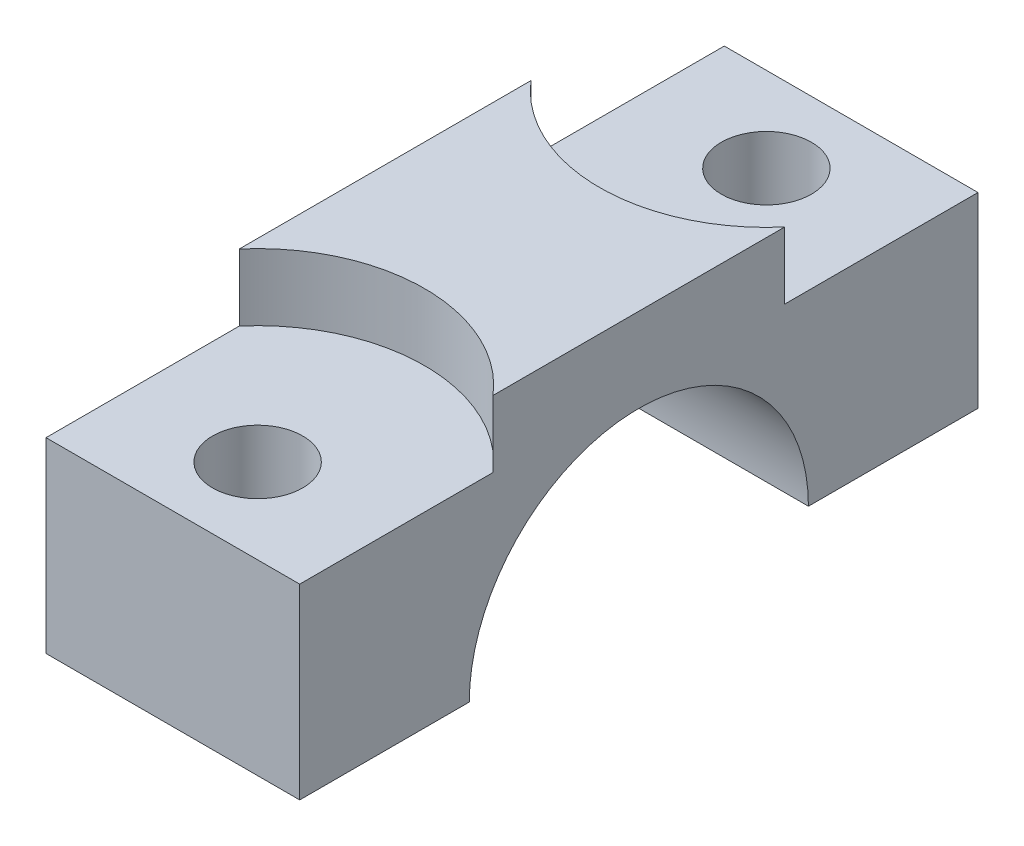
ISO-10303-21;
HEADER;
FILE_DESCRIPTION(('STEP AP214'),'2;1');
FILE_NAME('part.step','',(''),(''),'','','');
FILE_SCHEMA(('AUTOMOTIVE_DESIGN { 1 0 10303 214 1 1 1 1 }'));
ENDSEC;
DATA;
#1=APPLICATION_CONTEXT('core data for automotive mechanical design processes');
#2=APPLICATION_PROTOCOL_DEFINITION('international standard','automotive_design',2000,#1);
#3=PRODUCT_CONTEXT('',#1,'mechanical');
#4=PRODUCT('Part','Part','',(#3));
#5=PRODUCT_RELATED_PRODUCT_CATEGORY('part','',(#4));
#6=PRODUCT_DEFINITION_FORMATION('','',#4);
#7=PRODUCT_DEFINITION_CONTEXT('part definition',#1,'design');
#8=PRODUCT_DEFINITION('design','',#6,#7);
#9=PRODUCT_DEFINITION_SHAPE('','',#8);
#10=(LENGTH_UNIT() NAMED_UNIT(*) SI_UNIT(.MILLI.,.METRE.));
#11=(NAMED_UNIT(*) PLANE_ANGLE_UNIT() SI_UNIT($,.RADIAN.));
#12=(NAMED_UNIT(*) SI_UNIT($,.STERADIAN.) SOLID_ANGLE_UNIT());
#13=UNCERTAINTY_MEASURE_WITH_UNIT(LENGTH_MEASURE(1.E-05),#10,'distance_accuracy_value','');
#14=(GEOMETRIC_REPRESENTATION_CONTEXT(3) GLOBAL_UNCERTAINTY_ASSIGNED_CONTEXT((#13)) GLOBAL_UNIT_ASSIGNED_CONTEXT((#10,
#11,#12)) REPRESENTATION_CONTEXT('',''));
#15=CARTESIAN_POINT('',(0.,0.,0.));
#16=DIRECTION('',(0.,0.,1.));
#17=DIRECTION('',(1.,0.,0.));
#18=AXIS2_PLACEMENT_3D('',#15,#16,#17);
#19=CARTESIAN_POINT('',(9.5,19.,25.4));
#20=DIRECTION('',(0.,-1.,0.));
#21=DIRECTION('',(0.,0.,-1.));
#22=AXIS2_PLACEMENT_3D('',#19,#20,#21);
#23=PLANE('',#22);
#24=DIRECTION('',(0.,0.,1.));
#25=VECTOR('',#24,1.);
#26=CARTESIAN_POINT('',(9.5,19.,25.4));
#27=LINE('',#26,#25);
#28=CARTESIAN_POINT('',(9.5,19.,-10.925961595364));
#29=VERTEX_POINT('',#28);
#30=CARTESIAN_POINT('',(9.5,19.,10.925961595364));
#31=VERTEX_POINT('',#30);
#32=EDGE_CURVE('E163',#29,#31,#27,.T.);
#33=ORIENTED_EDGE('',*,*,#32,.F.);
#34=CARTESIAN_POINT('',(0.,19.,-19.05));
#35=DIRECTION('',(0.,1.,0.));
#36=DIRECTION('',(0.,0.,1.));
#37=AXIS2_PLACEMENT_3D('',#34,#35,#36);
#38=CIRCLE('',#37,12.5);
#39=CARTESIAN_POINT('',(-9.5,19.,-10.925961595364));
#40=VERTEX_POINT('',#39);
#41=EDGE_CURVE('E115',#40,#29,#38,.T.);
#42=ORIENTED_EDGE('',*,*,#41,.F.);
#43=DIRECTION('',(0.,0.,1.));
#44=VECTOR('',#43,1.);
#45=CARTESIAN_POINT('',(-9.5,19.,25.4));
#46=LINE('',#45,#44);
#47=CARTESIAN_POINT('',(-9.5,19.,10.925961595364));
#48=VERTEX_POINT('',#47);
#49=EDGE_CURVE('E55',#40,#48,#46,.T.);
#50=ORIENTED_EDGE('',*,*,#49,.T.);
#51=CARTESIAN_POINT('',(0.,19.,19.05));
#52=DIRECTION('',(0.,1.,0.));
#53=DIRECTION('',(0.,0.,1.));
#54=AXIS2_PLACEMENT_3D('',#51,#52,#53);
#55=CIRCLE('',#54,12.5);
#56=EDGE_CURVE('E119',#31,#48,#55,.T.);
#57=ORIENTED_EDGE('',*,*,#56,.F.);
#58=EDGE_LOOP('',(#33,#42,#50,#57));
#59=FACE_BOUND('',#58,.T.);
#60=ADVANCED_FACE('F32',(#59),#23,.F.);
#61=CARTESIAN_POINT('',(9.5,0.,25.4));
#62=DIRECTION('',(0.,0.,-1.));
#63=DIRECTION('',(-1.,0.,0.));
#64=AXIS2_PLACEMENT_3D('',#61,#62,#63);
#65=PLANE('',#64);
#66=DIRECTION('',(0.,-1.,0.));
#67=VECTOR('',#66,1.);
#68=CARTESIAN_POINT('',(9.5,0.,25.4));
#69=LINE('',#68,#67);
#70=CARTESIAN_POINT('',(9.5,14.,25.4));
#71=VERTEX_POINT('',#70);
#72=CARTESIAN_POINT('',(9.5,0.,25.4));
#73=VERTEX_POINT('',#72);
#74=EDGE_CURVE('E154',#71,#73,#69,.T.);
#75=ORIENTED_EDGE('',*,*,#74,.F.);
#76=DIRECTION('',(-1.,0.,0.));
#77=VECTOR('',#76,1.);
#78=CARTESIAN_POINT('',(9.5,14.,25.4));
#79=LINE('',#78,#77);
#80=CARTESIAN_POINT('',(-9.5,14.,25.4));
#81=VERTEX_POINT('',#80);
#82=EDGE_CURVE('E148',#71,#81,#79,.T.);
#83=ORIENTED_EDGE('',*,*,#82,.T.);
#84=DIRECTION('',(0.,-1.,0.));
#85=VECTOR('',#84,1.);
#86=CARTESIAN_POINT('',(-9.5,0.,25.4));
#87=LINE('',#86,#85);
#88=CARTESIAN_POINT('',(-9.5,0.,25.4));
#89=VERTEX_POINT('',#88);
#90=EDGE_CURVE('E153',#81,#89,#87,.T.);
#91=ORIENTED_EDGE('',*,*,#90,.T.);
#92=DIRECTION('',(-1.,0.,0.));
#93=VECTOR('',#92,1.);
#94=CARTESIAN_POINT('',(9.5,0.,25.4));
#95=LINE('',#94,#93);
#96=EDGE_CURVE('E185',#73,#89,#95,.T.);
#97=ORIENTED_EDGE('',*,*,#96,.F.);
#98=EDGE_LOOP('',(#75,#83,#91,#97));
#99=FACE_BOUND('',#98,.T.);
#100=ADVANCED_FACE('F34',(#99),#65,.F.);
#101=CARTESIAN_POINT('',(9.5,0.,25.4));
#102=DIRECTION('',(0.,1.,0.));
#103=DIRECTION('',(0.,0.,1.));
#104=AXIS2_PLACEMENT_3D('',#101,#102,#103);
#105=PLANE('',#104);
#106=CARTESIAN_POINT('',(0.,0.,19.05));
#107=DIRECTION('',(0.,1.,0.));
#108=DIRECTION('',(0.,0.,1.));
#109=AXIS2_PLACEMENT_3D('',#106,#107,#108);
#110=CIRCLE('',#109,3.375);
#111=CARTESIAN_POINT('',(0.,0.,22.425));
#112=VERTEX_POINT('',#111);
#113=EDGE_CURVE('E142',#112,#112,#110,.T.);
#114=ORIENTED_EDGE('',*,*,#113,.T.);
#115=EDGE_LOOP('',(#114));
#116=FACE_BOUND('',#115,.T.);
#117=DIRECTION('',(0.,0.,-1.));
#118=VECTOR('',#117,1.);
#119=CARTESIAN_POINT('',(-9.5,0.,25.4));
#120=LINE('',#119,#118);
#121=CARTESIAN_POINT('',(-9.5,0.,12.7));
#122=VERTEX_POINT('',#121);
#123=EDGE_CURVE('E167',#89,#122,#120,.T.);
#124=ORIENTED_EDGE('',*,*,#123,.T.);
#125=DIRECTION('',(-1.,0.,0.));
#126=VECTOR('',#125,1.);
#127=CARTESIAN_POINT('',(9.5,0.,12.7));
#128=LINE('',#127,#126);
#129=CARTESIAN_POINT('',(9.5,0.,12.7));
#130=VERTEX_POINT('',#129);
#131=EDGE_CURVE('E182',#130,#122,#128,.T.);
#132=ORIENTED_EDGE('',*,*,#131,.F.);
#133=DIRECTION('',(0.,0.,-1.));
#134=VECTOR('',#133,1.);
#135=CARTESIAN_POINT('',(9.5,0.,25.4));
#136=LINE('',#135,#134);
#137=EDGE_CURVE('E156',#73,#130,#136,.T.);
#138=ORIENTED_EDGE('',*,*,#137,.F.);
#139=ORIENTED_EDGE('',*,*,#96,.T.);
#140=EDGE_LOOP('',(#124,#132,#138,#139));
#141=FACE_BOUND('',#140,.T.);
#142=ADVANCED_FACE('F213',(#116,#141),#105,.F.);
#143=CARTESIAN_POINT('',(9.5,0.,0.));
#144=DIRECTION('',(-1.,0.,0.));
#145=DIRECTION('',(0.,0.,1.));
#146=AXIS2_PLACEMENT_3D('',#143,#144,#145);
#147=CYLINDRICAL_SURFACE('',#146,12.7);
#148=CARTESIAN_POINT('',(-9.5,0.,0.));
#149=DIRECTION('',(-1.,0.,0.));
#150=DIRECTION('',(0.,0.,-1.));
#151=AXIS2_PLACEMENT_3D('',#148,#149,#150);
#152=CIRCLE('',#151,12.7);
#153=CARTESIAN_POINT('',(-9.5,0.,-12.7));
#154=VERTEX_POINT('',#153);
#155=EDGE_CURVE('E169',#122,#154,#152,.T.);
#156=ORIENTED_EDGE('',*,*,#155,.T.);
#157=DIRECTION('',(-1.,0.,0.));
#158=VECTOR('',#157,1.);
#159=CARTESIAN_POINT('',(9.5,0.,-12.7));
#160=LINE('',#159,#158);
#161=CARTESIAN_POINT('',(9.5,0.,-12.7));
#162=VERTEX_POINT('',#161);
#163=EDGE_CURVE('E179',#162,#154,#160,.T.);
#164=ORIENTED_EDGE('',*,*,#163,.F.);
#165=CARTESIAN_POINT('',(9.5,0.,0.));
#166=DIRECTION('',(-1.,0.,0.));
#167=DIRECTION('',(0.,0.,-1.));
#168=AXIS2_PLACEMENT_3D('',#165,#166,#167);
#169=CIRCLE('',#168,12.7);
#170=EDGE_CURVE('E158',#130,#162,#169,.T.);
#171=ORIENTED_EDGE('',*,*,#170,.F.);
#172=ORIENTED_EDGE('',*,*,#131,.T.);
#173=EDGE_LOOP('',(#156,#164,#171,#172));
#174=FACE_BOUND('',#173,.T.);
#175=ADVANCED_FACE('F208',(#174),#147,.F.);
#176=CARTESIAN_POINT('',(9.5,0.,-12.7));
#177=DIRECTION('',(0.,1.,0.));
#178=DIRECTION('',(0.,0.,1.));
#179=AXIS2_PLACEMENT_3D('',#176,#177,#178);
#180=PLANE('',#179);
#181=CARTESIAN_POINT('',(0.,0.,-19.05));
#182=DIRECTION('',(0.,1.,0.));
#183=DIRECTION('',(0.,0.,1.));
#184=AXIS2_PLACEMENT_3D('',#181,#182,#183);
#185=CIRCLE('',#184,3.375);
#186=CARTESIAN_POINT('',(0.,0.,-15.675));
#187=VERTEX_POINT('',#186);
#188=EDGE_CURVE('E131',#187,#187,#185,.T.);
#189=ORIENTED_EDGE('',*,*,#188,.T.);
#190=EDGE_LOOP('',(#189));
#191=FACE_BOUND('',#190,.T.);
#192=DIRECTION('',(0.,0.,-1.));
#193=VECTOR('',#192,1.);
#194=CARTESIAN_POINT('',(-9.5,0.,-12.7));
#195=LINE('',#194,#193);
#196=CARTESIAN_POINT('',(-9.5,0.,-25.4));
#197=VERTEX_POINT('',#196);
#198=EDGE_CURVE('E171',#154,#197,#195,.T.);
#199=ORIENTED_EDGE('',*,*,#198,.T.);
#200=DIRECTION('',(-1.,0.,0.));
#201=VECTOR('',#200,1.);
#202=CARTESIAN_POINT('',(9.5,0.,-25.4));
#203=LINE('',#202,#201);
#204=CARTESIAN_POINT('',(9.5,0.,-25.4));
#205=VERTEX_POINT('',#204);
#206=EDGE_CURVE('E165',#205,#197,#203,.T.);
#207=ORIENTED_EDGE('',*,*,#206,.F.);
#208=DIRECTION('',(0.,0.,-1.));
#209=VECTOR('',#208,1.);
#210=CARTESIAN_POINT('',(9.5,0.,-12.7));
#211=LINE('',#210,#209);
#212=EDGE_CURVE('E160',#162,#205,#211,.T.);
#213=ORIENTED_EDGE('',*,*,#212,.F.);
#214=ORIENTED_EDGE('',*,*,#163,.T.);
#215=EDGE_LOOP('',(#199,#207,#213,#214));
#216=FACE_BOUND('',#215,.T.);
#217=ADVANCED_FACE('F202',(#191,#216),#180,.F.);
#218=CARTESIAN_POINT('',(9.5,0.,-25.4));
#219=DIRECTION('',(0.,0.,1.));
#220=DIRECTION('',(1.,0.,0.));
#221=AXIS2_PLACEMENT_3D('',#218,#219,#220);
#222=PLANE('',#221);
#223=DIRECTION('',(0.,1.,0.));
#224=VECTOR('',#223,1.);
#225=CARTESIAN_POINT('',(-9.5,0.,-25.4));
#226=LINE('',#225,#224);
#227=CARTESIAN_POINT('',(-9.5,14.,-25.4));
#228=VERTEX_POINT('',#227);
#229=EDGE_CURVE('E173',#197,#228,#226,.T.);
#230=ORIENTED_EDGE('',*,*,#229,.T.);
#231=DIRECTION('',(1.,0.,0.));
#232=VECTOR('',#231,1.);
#233=CARTESIAN_POINT('',(9.5,14.,-25.4));
#234=LINE('',#233,#232);
#235=CARTESIAN_POINT('',(9.5,14.,-25.4));
#236=VERTEX_POINT('',#235);
#237=EDGE_CURVE('E47',#228,#236,#234,.T.);
#238=ORIENTED_EDGE('',*,*,#237,.T.);
#239=DIRECTION('',(0.,1.,0.));
#240=VECTOR('',#239,1.);
#241=CARTESIAN_POINT('',(9.5,0.,-25.4));
#242=LINE('',#241,#240);
#243=EDGE_CURVE('E129',#205,#236,#242,.T.);
#244=ORIENTED_EDGE('',*,*,#243,.F.);
#245=ORIENTED_EDGE('',*,*,#206,.T.);
#246=EDGE_LOOP('',(#230,#238,#244,#245));
#247=FACE_BOUND('',#246,.T.);
#248=ADVANCED_FACE('F198',(#247),#222,.F.);
#249=CARTESIAN_POINT('',(9.5,0.,0.));
#250=DIRECTION('',(1.,0.,0.));
#251=DIRECTION('',(0.,0.,-1.));
#252=AXIS2_PLACEMENT_3D('',#249,#250,#251);
#253=PLANE('',#252);
#254=DIRECTION('',(0.,0.,-1.));
#255=VECTOR('',#254,1.);
#256=CARTESIAN_POINT('',(9.5,14.,0.));
#257=LINE('',#256,#255);
#258=CARTESIAN_POINT('',(9.5,14.,-10.925961595364));
#259=VERTEX_POINT('',#258);
#260=EDGE_CURVE('E120',#259,#236,#257,.T.);
#261=ORIENTED_EDGE('',*,*,#260,.F.);
#262=DIRECTION('',(0.,1.,0.));
#263=VECTOR('',#262,1.);
#264=CARTESIAN_POINT('',(9.5,19.,-10.925961595364));
#265=LINE('',#264,#263);
#266=EDGE_CURVE('E111',#29,#259,#265,.F.);
#267=ORIENTED_EDGE('',*,*,#266,.F.);
#268=ORIENTED_EDGE('',*,*,#32,.T.);
#269=DIRECTION('',(0.,1.,0.));
#270=VECTOR('',#269,1.);
#271=CARTESIAN_POINT('',(9.5,19.,10.925961595364));
#272=LINE('',#271,#270);
#273=CARTESIAN_POINT('',(9.5,14.,10.925961595364));
#274=VERTEX_POINT('',#273);
#275=EDGE_CURVE('E145',#274,#31,#272,.T.);
#276=ORIENTED_EDGE('',*,*,#275,.F.);
#277=DIRECTION('',(0.,0.,-1.));
#278=VECTOR('',#277,1.);
#279=CARTESIAN_POINT('',(9.5,14.,0.));
#280=LINE('',#279,#278);
#281=EDGE_CURVE('E151',#71,#274,#280,.T.);
#282=ORIENTED_EDGE('',*,*,#281,.F.);
#283=ORIENTED_EDGE('',*,*,#74,.T.);
#284=ORIENTED_EDGE('',*,*,#137,.T.);
#285=ORIENTED_EDGE('',*,*,#170,.T.);
#286=ORIENTED_EDGE('',*,*,#212,.T.);
#287=ORIENTED_EDGE('',*,*,#243,.T.);
#288=EDGE_LOOP('',(#261,#267,#268,#276,#282,#283,#284,#285,#286,#287));
#289=FACE_BOUND('',#288,.T.);
#290=ADVANCED_FACE('F127',(#289),#253,.T.);
#291=CARTESIAN_POINT('',(-9.5,0.,0.));
#292=DIRECTION('',(1.,0.,0.));
#293=DIRECTION('',(0.,0.,-1.));
#294=AXIS2_PLACEMENT_3D('',#291,#292,#293);
#295=PLANE('',#294);
#296=ORIENTED_EDGE('',*,*,#49,.F.);
#297=DIRECTION('',(0.,1.,0.));
#298=VECTOR('',#297,1.);
#299=CARTESIAN_POINT('',(-9.5,19.,-10.925961595364));
#300=LINE('',#299,#298);
#301=CARTESIAN_POINT('',(-9.5,14.,-10.925961595364));
#302=VERTEX_POINT('',#301);
#303=EDGE_CURVE('E11',#40,#302,#300,.F.);
#304=ORIENTED_EDGE('',*,*,#303,.T.);
#305=DIRECTION('',(0.,0.,-1.));
#306=VECTOR('',#305,1.);
#307=CARTESIAN_POINT('',(-9.5,14.,0.));
#308=LINE('',#307,#306);
#309=EDGE_CURVE('E40',#302,#228,#308,.T.);
#310=ORIENTED_EDGE('',*,*,#309,.T.);
#311=ORIENTED_EDGE('',*,*,#229,.F.);
#312=ORIENTED_EDGE('',*,*,#198,.F.);
#313=ORIENTED_EDGE('',*,*,#155,.F.);
#314=ORIENTED_EDGE('',*,*,#123,.F.);
#315=ORIENTED_EDGE('',*,*,#90,.F.);
#316=DIRECTION('',(0.,0.,-1.));
#317=VECTOR('',#316,1.);
#318=CARTESIAN_POINT('',(-9.5,14.,0.));
#319=LINE('',#318,#317);
#320=CARTESIAN_POINT('',(-9.5,14.,10.925961595364));
#321=VERTEX_POINT('',#320);
#322=EDGE_CURVE('E191',#81,#321,#319,.T.);
#323=ORIENTED_EDGE('',*,*,#322,.T.);
#324=DIRECTION('',(0.,1.,0.));
#325=VECTOR('',#324,1.);
#326=CARTESIAN_POINT('',(-9.5,19.,10.925961595364));
#327=LINE('',#326,#325);
#328=EDGE_CURVE('E188',#321,#48,#327,.T.);
#329=ORIENTED_EDGE('',*,*,#328,.T.);
#330=EDGE_LOOP('',(#296,#304,#310,#311,#312,#313,#314,#315,#323,#329));
#331=FACE_BOUND('',#330,.T.);
#332=ADVANCED_FACE('F195',(#331),#295,.F.);
#333=CARTESIAN_POINT('',(0.,19.,19.05));
#334=DIRECTION('',(0.,1.,0.));
#335=DIRECTION('',(0.,0.,1.));
#336=AXIS2_PLACEMENT_3D('',#333,#334,#335);
#337=CYLINDRICAL_SURFACE('',#336,3.375);
#338=ORIENTED_EDGE('',*,*,#113,.F.);
#339=EDGE_LOOP('',(#338));
#340=FACE_BOUND('',#339,.T.);
#341=CARTESIAN_POINT('',(0.,14.,19.05));
#342=DIRECTION('',(0.,1.,0.));
#343=DIRECTION('',(0.,0.,1.));
#344=AXIS2_PLACEMENT_3D('',#341,#342,#343);
#345=CIRCLE('',#344,3.375);
#346=CARTESIAN_POINT('',(0.,14.,22.425));
#347=VERTEX_POINT('',#346);
#348=EDGE_CURVE('E139',#347,#347,#345,.T.);
#349=ORIENTED_EDGE('',*,*,#348,.T.);
#350=EDGE_LOOP('',(#349));
#351=FACE_BOUND('',#350,.T.);
#352=ADVANCED_FACE('F262',(#340,#351),#337,.F.);
#353=CARTESIAN_POINT('',(3.375,14.,19.05));
#354=DIRECTION('',(0.,-1.,0.));
#355=DIRECTION('',(0.,0.,-1.));
#356=AXIS2_PLACEMENT_3D('',#353,#354,#355);
#357=PLANE('',#356);
#358=ORIENTED_EDGE('',*,*,#281,.T.);
#359=CARTESIAN_POINT('',(0.,14.,19.05));
#360=DIRECTION('',(0.,1.,0.));
#361=DIRECTION('',(0.,0.,1.));
#362=AXIS2_PLACEMENT_3D('',#359,#360,#361);
#363=CIRCLE('',#362,12.5);
#364=EDGE_CURVE('E136',#274,#321,#363,.T.);
#365=ORIENTED_EDGE('',*,*,#364,.T.);
#366=ORIENTED_EDGE('',*,*,#322,.F.);
#367=ORIENTED_EDGE('',*,*,#82,.F.);
#368=EDGE_LOOP('',(#358,#365,#366,#367));
#369=FACE_BOUND('',#368,.T.);
#370=ORIENTED_EDGE('',*,*,#348,.F.);
#371=EDGE_LOOP('',(#370));
#372=FACE_BOUND('',#371,.T.);
#373=ADVANCED_FACE('F218',(#369,#372),#357,.F.);
#374=CARTESIAN_POINT('',(0.,19.,19.05));
#375=DIRECTION('',(0.,1.,0.));
#376=DIRECTION('',(0.,0.,1.));
#377=AXIS2_PLACEMENT_3D('',#374,#375,#376);
#378=CYLINDRICAL_SURFACE('',#377,12.5);
#379=ORIENTED_EDGE('',*,*,#275,.T.);
#380=ORIENTED_EDGE('',*,*,#56,.T.);
#381=ORIENTED_EDGE('',*,*,#328,.F.);
#382=ORIENTED_EDGE('',*,*,#364,.F.);
#383=EDGE_LOOP('',(#379,#380,#381,#382));
#384=FACE_BOUND('',#383,.T.);
#385=ADVANCED_FACE('F224',(#384),#378,.F.);
#386=CARTESIAN_POINT('',(0.,19.,-19.05));
#387=DIRECTION('',(0.,1.,0.));
#388=DIRECTION('',(0.,0.,1.));
#389=AXIS2_PLACEMENT_3D('',#386,#387,#388);
#390=CYLINDRICAL_SURFACE('',#389,3.375);
#391=ORIENTED_EDGE('',*,*,#188,.F.);
#392=EDGE_LOOP('',(#391));
#393=FACE_BOUND('',#392,.T.);
#394=CARTESIAN_POINT('',(0.,14.,-19.05));
#395=DIRECTION('',(0.,1.,0.));
#396=DIRECTION('',(0.,0.,1.));
#397=AXIS2_PLACEMENT_3D('',#394,#395,#396);
#398=CIRCLE('',#397,3.375);
#399=CARTESIAN_POINT('',(0.,14.,-15.675));
#400=VERTEX_POINT('',#399);
#401=EDGE_CURVE('E124',#400,#400,#398,.T.);
#402=ORIENTED_EDGE('',*,*,#401,.T.);
#403=EDGE_LOOP('',(#402));
#404=FACE_BOUND('',#403,.T.);
#405=ADVANCED_FACE('F232',(#393,#404),#390,.F.);
#406=CARTESIAN_POINT('',(3.375,14.,-19.05));
#407=DIRECTION('',(0.,-1.,0.));
#408=DIRECTION('',(0.,0.,-1.));
#409=AXIS2_PLACEMENT_3D('',#406,#407,#408);
#410=PLANE('',#409);
#411=ORIENTED_EDGE('',*,*,#260,.T.);
#412=ORIENTED_EDGE('',*,*,#237,.F.);
#413=ORIENTED_EDGE('',*,*,#309,.F.);
#414=CARTESIAN_POINT('',(0.,14.,-19.05));
#415=DIRECTION('',(0.,1.,0.));
#416=DIRECTION('',(0.,0.,1.));
#417=AXIS2_PLACEMENT_3D('',#414,#415,#416);
#418=CIRCLE('',#417,12.5);
#419=EDGE_CURVE('E114',#302,#259,#418,.T.);
#420=ORIENTED_EDGE('',*,*,#419,.T.);
#421=EDGE_LOOP('',(#411,#412,#413,#420));
#422=FACE_BOUND('',#421,.T.);
#423=ORIENTED_EDGE('',*,*,#401,.F.);
#424=EDGE_LOOP('',(#423));
#425=FACE_BOUND('',#424,.T.);
#426=ADVANCED_FACE('F122',(#422,#425),#410,.F.);
#427=CARTESIAN_POINT('',(0.,19.,-19.05));
#428=DIRECTION('',(0.,1.,0.));
#429=DIRECTION('',(0.,0.,1.));
#430=AXIS2_PLACEMENT_3D('',#427,#428,#429);
#431=CYLINDRICAL_SURFACE('',#430,12.5);
#432=ORIENTED_EDGE('',*,*,#266,.T.);
#433=ORIENTED_EDGE('',*,*,#419,.F.);
#434=ORIENTED_EDGE('',*,*,#303,.F.);
#435=ORIENTED_EDGE('',*,*,#41,.T.);
#436=EDGE_LOOP('',(#432,#433,#434,#435));
#437=FACE_BOUND('',#436,.T.);
#438=ADVANCED_FACE('F113',(#437),#431,.F.);
#439=CLOSED_SHELL('',(#60,#100,#142,#175,#217,#248,#290,#332,#352,#373,#385,#405,#426,#438));
#440=MANIFOLD_SOLID_BREP('B2',#439);
#441=ADVANCED_BREP_SHAPE_REPRESENTATION('',(#18,#440),#14);
#442=SHAPE_DEFINITION_REPRESENTATION(#9,#441);
ENDSEC;
END-ISO-10303-21;
